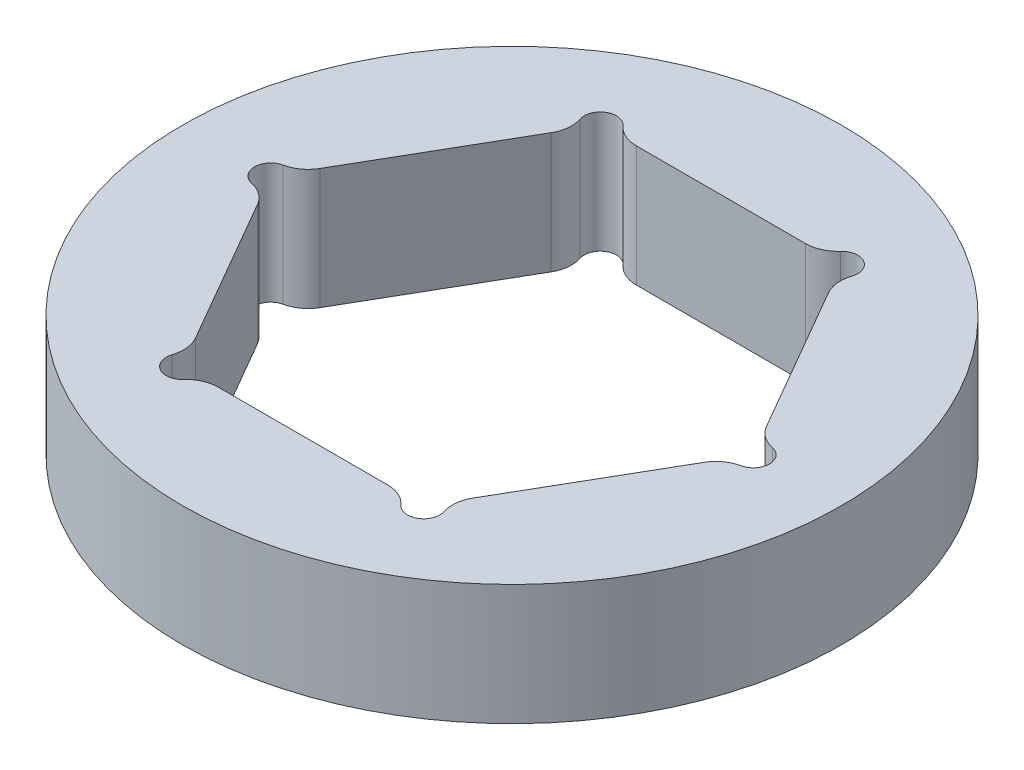
ISO-10303-21;
HEADER;
FILE_DESCRIPTION(('STEP AP214'),'2;1');
FILE_NAME('part.step','',(''),(''),'','','');
FILE_SCHEMA(('AUTOMOTIVE_DESIGN { 1 0 10303 214 1 1 1 1 }'));
ENDSEC;
DATA;
#1=APPLICATION_CONTEXT('core data for automotive mechanical design processes');
#2=APPLICATION_PROTOCOL_DEFINITION('international standard','automotive_design',2000,#1);
#3=PRODUCT_CONTEXT('',#1,'mechanical');
#4=PRODUCT('Part','Part','',(#3));
#5=PRODUCT_RELATED_PRODUCT_CATEGORY('part','',(#4));
#6=PRODUCT_DEFINITION_FORMATION('','',#4);
#7=PRODUCT_DEFINITION_CONTEXT('part definition',#1,'design');
#8=PRODUCT_DEFINITION('design','',#6,#7);
#9=PRODUCT_DEFINITION_SHAPE('','',#8);
#10=(LENGTH_UNIT() NAMED_UNIT(*) SI_UNIT(.MILLI.,.METRE.));
#11=(NAMED_UNIT(*) PLANE_ANGLE_UNIT() SI_UNIT($,.RADIAN.));
#12=(NAMED_UNIT(*) SI_UNIT($,.STERADIAN.) SOLID_ANGLE_UNIT());
#13=UNCERTAINTY_MEASURE_WITH_UNIT(LENGTH_MEASURE(1.E-05),#10,'distance_accuracy_value','');
#14=(GEOMETRIC_REPRESENTATION_CONTEXT(3) GLOBAL_UNCERTAINTY_ASSIGNED_CONTEXT((#13)) GLOBAL_UNIT_ASSIGNED_CONTEXT((#10,
#11,#12)) REPRESENTATION_CONTEXT('',''));
#15=CARTESIAN_POINT('',(0.,0.,0.));
#16=DIRECTION('',(0.,0.,1.));
#17=DIRECTION('',(1.,0.,0.));
#18=AXIS2_PLACEMENT_3D('',#15,#16,#17);
#19=CARTESIAN_POINT('',(0.,0.75,0.));
#20=DIRECTION('',(0.,1.,0.));
#21=DIRECTION('',(0.,0.,1.));
#22=AXIS2_PLACEMENT_3D('',#19,#20,#21);
#23=PLANE('',#22);
#24=CARTESIAN_POINT('',(0.,0.75,0.));
#25=DIRECTION('',(0.,1.,0.));
#26=DIRECTION('',(0.,0.,1.));
#27=AXIS2_PLACEMENT_3D('',#24,#25,#26);
#28=CIRCLE('',#27,4.1);
#29=CARTESIAN_POINT('',(0.,0.75,4.1));
#30=VERTEX_POINT('',#29);
#31=EDGE_CURVE('E11',#30,#30,#28,.T.);
#32=ORIENTED_EDGE('',*,*,#31,.T.);
#33=EDGE_LOOP('',(#32));
#34=FACE_BOUND('',#33,.T.);
#35=CARTESIAN_POINT('',(-1.50111069989303,0.75,-2.6));
#36=DIRECTION('',(0.,1.,0.));
#37=DIRECTION('',(0.,0.,1.));
#38=AXIS2_PLACEMENT_3D('',#35,#36,#37);
#39=CIRCLE('',#38,0.2);
#40=CARTESIAN_POINT('',(-1.35203950139304,0.75,-2.73333333333333));
#41=VERTEX_POINT('',#40);
#42=CARTESIAN_POINT('',(-1.69111635298094,0.75,-2.53756722179308));
#43=VERTEX_POINT('',#42);
#44=EDGE_CURVE('E206',#41,#43,#39,.T.);
#45=ORIENTED_EDGE('',*,*,#44,.F.);
#46=CARTESIAN_POINT('',(-1.05389710439307,0.75,-3.));
#47=DIRECTION('',(0.,-1.,0.));
#48=DIRECTION('',(0.,0.,1.));
#49=AXIS2_PLACEMENT_3D('',#46,#47,#48);
#50=CIRCLE('',#49,0.4);
#51=CARTESIAN_POINT('',(-1.05389710439307,0.75,-2.6));
#52=VERTEX_POINT('',#51);
#53=EDGE_CURVE('E198',#52,#41,#50,.T.);
#54=ORIENTED_EDGE('',*,*,#53,.F.);
#55=DIRECTION('',(-1.,0.,0.));
#56=VECTOR('',#55,1.);
#57=CARTESIAN_POINT('',(1.05389710439307,0.75,-2.6));
#58=LINE('',#57,#56);
#59=CARTESIAN_POINT('',(1.05389710439307,0.75,-2.6));
#60=VERTEX_POINT('',#59);
#61=EDGE_CURVE('E262',#60,#52,#58,.T.);
#62=ORIENTED_EDGE('',*,*,#61,.F.);
#63=CARTESIAN_POINT('',(1.05389710439307,0.75,-3.));
#64=DIRECTION('',(0.,-1.,0.));
#65=DIRECTION('',(0.,0.,1.));
#66=AXIS2_PLACEMENT_3D('',#63,#64,#65);
#67=CIRCLE('',#66,0.400000000000001);
#68=CARTESIAN_POINT('',(1.35203950139304,0.75,-2.73333333333333));
#69=VERTEX_POINT('',#68);
#70=EDGE_CURVE('E260',#69,#60,#67,.T.);
#71=ORIENTED_EDGE('',*,*,#70,.F.);
#72=CARTESIAN_POINT('',(1.50111069989303,0.75,-2.6));
#73=DIRECTION('',(0.,1.,0.));
#74=DIRECTION('',(0.,0.,1.));
#75=AXIS2_PLACEMENT_3D('',#72,#73,#74);
#76=CIRCLE('',#75,0.2);
#77=CARTESIAN_POINT('',(1.69111635298095,0.75,-2.53756722179308));
#78=VERTEX_POINT('',#77);
#79=EDGE_CURVE('E258',#78,#69,#76,.T.);
#80=ORIENTED_EDGE('',*,*,#79,.F.);
#81=CARTESIAN_POINT('',(2.07112765915678,0.75,-2.41270166537926));
#82=DIRECTION('',(0.,-1.,0.));
#83=DIRECTION('',(0.,0.,1.));
#84=AXIS2_PLACEMENT_3D('',#81,#82,#83);
#85=CIRCLE('',#84,0.399999999999999);
#86=CARTESIAN_POINT('',(1.72471749764301,0.75,-2.21270166537926));
#87=VERTEX_POINT('',#86);
#88=EDGE_CURVE('E256',#87,#78,#85,.T.);
#89=ORIENTED_EDGE('',*,*,#88,.F.);
#90=DIRECTION('',(-0.5,0.,-0.866025403784439));
#91=VECTOR('',#90,1.);
#92=CARTESIAN_POINT('',(2.77861460203608,0.75,-0.387298334620741));
#93=LINE('',#92,#91);
#94=CARTESIAN_POINT('',(2.77861460203608,0.75,-0.387298334620741));
#95=VERTEX_POINT('',#94);
#96=EDGE_CURVE('E254',#95,#87,#93,.T.);
#97=ORIENTED_EDGE('',*,*,#96,.F.);
#98=CARTESIAN_POINT('',(3.12502476354985,0.75,-0.58729833462074));
#99=DIRECTION('',(0.,-1.,0.));
#100=DIRECTION('',(0.,0.,1.));
#101=AXIS2_PLACEMENT_3D('',#98,#99,#100);
#102=CIRCLE('',#101,0.4);
#103=CARTESIAN_POINT('',(3.04315585437399,0.75,-0.195766111540246));
#104=VERTEX_POINT('',#103);
#105=EDGE_CURVE('E252',#104,#95,#102,.T.);
#106=ORIENTED_EDGE('',*,*,#105,.F.);
#107=CARTESIAN_POINT('',(3.00222139978606,0.75,0.));
#108=DIRECTION('',(0.,1.,0.));
#109=DIRECTION('',(0.,0.,1.));
#110=AXIS2_PLACEMENT_3D('',#107,#108,#109);
#111=CIRCLE('',#110,0.2);
#112=CARTESIAN_POINT('',(3.04315585437399,0.75,0.195766111540249));
#113=VERTEX_POINT('',#112);
#114=EDGE_CURVE('E250',#113,#104,#111,.T.);
#115=ORIENTED_EDGE('',*,*,#114,.F.);
#116=CARTESIAN_POINT('',(3.12502476354985,0.75,0.587298334620743));
#117=DIRECTION('',(0.,-1.,0.));
#118=DIRECTION('',(0.,0.,1.));
#119=AXIS2_PLACEMENT_3D('',#116,#117,#118);
#120=CIRCLE('',#119,0.4);
#121=CARTESIAN_POINT('',(2.77861460203608,0.75,0.387298334620744));
#122=VERTEX_POINT('',#121);
#123=EDGE_CURVE('E248',#122,#113,#120,.T.);
#124=ORIENTED_EDGE('',*,*,#123,.F.);
#125=DIRECTION('',(0.5,0.,-0.866025403784438));
#126=VECTOR('',#125,1.);
#127=CARTESIAN_POINT('',(1.72471749764301,0.75,2.21270166537926));
#128=LINE('',#127,#126);
#129=CARTESIAN_POINT('',(1.72471749764301,0.75,2.21270166537926));
#130=VERTEX_POINT('',#129);
#131=EDGE_CURVE('E246',#130,#122,#128,.T.);
#132=ORIENTED_EDGE('',*,*,#131,.F.);
#133=CARTESIAN_POINT('',(2.07112765915678,0.75,2.41270166537926));
#134=DIRECTION('',(0.,-1.,0.));
#135=DIRECTION('',(0.,0.,1.));
#136=AXIS2_PLACEMENT_3D('',#133,#134,#135);
#137=CIRCLE('',#136,0.4);
#138=CARTESIAN_POINT('',(1.69111635298095,0.75,2.53756722179309));
#139=VERTEX_POINT('',#138);
#140=EDGE_CURVE('E244',#139,#130,#137,.T.);
#141=ORIENTED_EDGE('',*,*,#140,.F.);
#142=CARTESIAN_POINT('',(1.50111069989303,0.75,2.6));
#143=DIRECTION('',(0.,1.,0.));
#144=DIRECTION('',(0.,0.,1.));
#145=AXIS2_PLACEMENT_3D('',#142,#143,#144);
#146=CIRCLE('',#145,0.2);
#147=CARTESIAN_POINT('',(1.35203950139304,0.75,2.73333333333334));
#148=VERTEX_POINT('',#147);
#149=EDGE_CURVE('E242',#148,#139,#146,.T.);
#150=ORIENTED_EDGE('',*,*,#149,.F.);
#151=CARTESIAN_POINT('',(1.05389710439307,0.75,3.));
#152=DIRECTION('',(0.,-1.,0.));
#153=DIRECTION('',(0.,0.,1.));
#154=AXIS2_PLACEMENT_3D('',#151,#152,#153);
#155=CIRCLE('',#154,0.4);
#156=CARTESIAN_POINT('',(1.05389710439307,0.75,2.6));
#157=VERTEX_POINT('',#156);
#158=EDGE_CURVE('E240',#157,#148,#155,.T.);
#159=ORIENTED_EDGE('',*,*,#158,.F.);
#160=DIRECTION('',(1.,0.,0.));
#161=VECTOR('',#160,1.);
#162=CARTESIAN_POINT('',(-1.05389710439306,0.75,2.6));
#163=LINE('',#162,#161);
#164=CARTESIAN_POINT('',(-1.05389710439306,0.75,2.6));
#165=VERTEX_POINT('',#164);
#166=EDGE_CURVE('E238',#165,#157,#163,.T.);
#167=ORIENTED_EDGE('',*,*,#166,.F.);
#168=CARTESIAN_POINT('',(-1.05389710439306,0.75,3.));
#169=DIRECTION('',(0.,-1.,0.));
#170=DIRECTION('',(0.,0.,1.));
#171=AXIS2_PLACEMENT_3D('',#168,#169,#170);
#172=CIRCLE('',#171,0.4);
#173=CARTESIAN_POINT('',(-1.35203950139304,0.75,2.73333333333333));
#174=VERTEX_POINT('',#173);
#175=EDGE_CURVE('E236',#174,#165,#172,.T.);
#176=ORIENTED_EDGE('',*,*,#175,.F.);
#177=CARTESIAN_POINT('',(-1.50111069989303,0.75,2.6));
#178=DIRECTION('',(0.,1.,0.));
#179=DIRECTION('',(0.,0.,1.));
#180=AXIS2_PLACEMENT_3D('',#177,#178,#179);
#181=CIRCLE('',#180,0.2);
#182=CARTESIAN_POINT('',(-1.69111635298094,0.75,2.53756722179309));
#183=VERTEX_POINT('',#182);
#184=EDGE_CURVE('E234',#183,#174,#181,.T.);
#185=ORIENTED_EDGE('',*,*,#184,.F.);
#186=CARTESIAN_POINT('',(-2.07112765915678,0.75,2.41270166537926));
#187=DIRECTION('',(0.,-1.,0.));
#188=DIRECTION('',(0.,0.,1.));
#189=AXIS2_PLACEMENT_3D('',#186,#187,#188);
#190=CIRCLE('',#189,0.4);
#191=CARTESIAN_POINT('',(-1.724717497643,0.75,2.21270166537926));
#192=VERTEX_POINT('',#191);
#193=EDGE_CURVE('E232',#192,#183,#190,.T.);
#194=ORIENTED_EDGE('',*,*,#193,.F.);
#195=DIRECTION('',(0.5,0.,0.866025403784439));
#196=VECTOR('',#195,1.);
#197=CARTESIAN_POINT('',(-2.77861460203607,0.75,0.387298334620747));
#198=LINE('',#197,#196);
#199=CARTESIAN_POINT('',(-2.77861460203607,0.75,0.387298334620746));
#200=VERTEX_POINT('',#199);
#201=EDGE_CURVE('E230',#200,#192,#198,.T.);
#202=ORIENTED_EDGE('',*,*,#201,.F.);
#203=CARTESIAN_POINT('',(-3.12502476354985,0.75,0.587298334620746));
#204=DIRECTION('',(0.,-1.,0.));
#205=DIRECTION('',(0.,0.,1.));
#206=AXIS2_PLACEMENT_3D('',#203,#204,#205);
#207=CIRCLE('',#206,0.4);
#208=CARTESIAN_POINT('',(-3.04315585437398,0.75,0.195766111540248));
#209=VERTEX_POINT('',#208);
#210=EDGE_CURVE('E228',#209,#200,#207,.T.);
#211=ORIENTED_EDGE('',*,*,#210,.F.);
#212=CARTESIAN_POINT('',(-3.00222139978605,0.75,0.));
#213=DIRECTION('',(0.,1.,0.));
#214=DIRECTION('',(0.,0.,1.));
#215=AXIS2_PLACEMENT_3D('',#212,#213,#214);
#216=CIRCLE('',#215,0.2);
#217=CARTESIAN_POINT('',(-3.04315585437398,0.75,-0.195766111540243));
#218=VERTEX_POINT('',#217);
#219=EDGE_CURVE('E226',#218,#209,#216,.T.);
#220=ORIENTED_EDGE('',*,*,#219,.F.);
#221=CARTESIAN_POINT('',(-3.12502476354985,0.75,-0.587298334620737));
#222=DIRECTION('',(0.,-1.,0.));
#223=DIRECTION('',(0.,0.,1.));
#224=AXIS2_PLACEMENT_3D('',#221,#222,#223);
#225=CIRCLE('',#224,0.4);
#226=CARTESIAN_POINT('',(-2.77861460203607,0.75,-0.387298334620738));
#227=VERTEX_POINT('',#226);
#228=EDGE_CURVE('E224',#227,#218,#225,.T.);
#229=ORIENTED_EDGE('',*,*,#228,.F.);
#230=DIRECTION('',(-0.5,0.,0.866025403784438));
#231=VECTOR('',#230,1.);
#232=CARTESIAN_POINT('',(-1.724717497643,0.75,-2.21270166537925));
#233=LINE('',#232,#231);
#234=CARTESIAN_POINT('',(-1.724717497643,0.75,-2.21270166537925));
#235=VERTEX_POINT('',#234);
#236=EDGE_CURVE('E220',#235,#227,#233,.T.);
#237=ORIENTED_EDGE('',*,*,#236,.F.);
#238=CARTESIAN_POINT('',(-2.07112765915678,0.75,-2.41270166537926));
#239=DIRECTION('',(0.,-1.,0.));
#240=DIRECTION('',(0.,0.,1.));
#241=AXIS2_PLACEMENT_3D('',#238,#239,#240);
#242=CIRCLE('',#241,0.4);
#243=EDGE_CURVE('E218',#43,#235,#242,.T.);
#244=ORIENTED_EDGE('',*,*,#243,.F.);
#245=EDGE_LOOP('',(#45,#54,#62,#71,#80,#89,#97,#106,#115,#124,#132,#141,#150,#159,#167,#176,
#185,#194,#202,#211,#220,#229,#237,#244));
#246=FACE_BOUND('',#245,.T.);
#247=ADVANCED_FACE('F37',(#34,#246),#23,.T.);
#248=CARTESIAN_POINT('',(0.,-0.75,0.));
#249=DIRECTION('',(0.,1.,0.));
#250=DIRECTION('',(0.,0.,1.));
#251=AXIS2_PLACEMENT_3D('',#248,#249,#250);
#252=PLANE('',#251);
#253=CARTESIAN_POINT('',(0.,-0.75,0.));
#254=DIRECTION('',(0.,1.,0.));
#255=DIRECTION('',(0.,0.,1.));
#256=AXIS2_PLACEMENT_3D('',#253,#254,#255);
#257=CIRCLE('',#256,4.1);
#258=CARTESIAN_POINT('',(0.,-0.75,4.1));
#259=VERTEX_POINT('',#258);
#260=EDGE_CURVE('E41',#259,#259,#257,.T.);
#261=ORIENTED_EDGE('',*,*,#260,.F.);
#262=EDGE_LOOP('',(#261));
#263=FACE_BOUND('',#262,.T.);
#264=CARTESIAN_POINT('',(-1.05389710439307,-0.75,-3.));
#265=DIRECTION('',(0.,-1.,0.));
#266=DIRECTION('',(0.,0.,1.));
#267=AXIS2_PLACEMENT_3D('',#264,#265,#266);
#268=CIRCLE('',#267,0.4);
#269=CARTESIAN_POINT('',(-1.05389710439307,-0.75,-2.6));
#270=VERTEX_POINT('',#269);
#271=CARTESIAN_POINT('',(-1.35203950139304,-0.75,-2.73333333333333));
#272=VERTEX_POINT('',#271);
#273=EDGE_CURVE('E60',#270,#272,#268,.T.);
#274=ORIENTED_EDGE('',*,*,#273,.T.);
#275=CARTESIAN_POINT('',(-1.50111069989303,-0.75,-2.6));
#276=DIRECTION('',(0.,1.,0.));
#277=DIRECTION('',(0.,0.,1.));
#278=AXIS2_PLACEMENT_3D('',#275,#276,#277);
#279=CIRCLE('',#278,0.2);
#280=CARTESIAN_POINT('',(-1.69111635298094,-0.75,-2.53756722179308));
#281=VERTEX_POINT('',#280);
#282=EDGE_CURVE('E213',#272,#281,#279,.T.);
#283=ORIENTED_EDGE('',*,*,#282,.T.);
#284=CARTESIAN_POINT('',(-2.07112765915678,-0.75,-2.41270166537926));
#285=DIRECTION('',(0.,-1.,0.));
#286=DIRECTION('',(0.,0.,1.));
#287=AXIS2_PLACEMENT_3D('',#284,#285,#286);
#288=CIRCLE('',#287,0.4);
#289=CARTESIAN_POINT('',(-1.724717497643,-0.75,-2.21270166537925));
#290=VERTEX_POINT('',#289);
#291=EDGE_CURVE('E266',#281,#290,#288,.T.);
#292=ORIENTED_EDGE('',*,*,#291,.T.);
#293=DIRECTION('',(-0.5,0.,0.866025403784438));
#294=VECTOR('',#293,1.);
#295=CARTESIAN_POINT('',(-1.724717497643,-0.75,-2.21270166537925));
#296=LINE('',#295,#294);
#297=CARTESIAN_POINT('',(-2.77861460203607,-0.75,-0.387298334620738));
#298=VERTEX_POINT('',#297);
#299=EDGE_CURVE('E269',#290,#298,#296,.T.);
#300=ORIENTED_EDGE('',*,*,#299,.T.);
#301=CARTESIAN_POINT('',(-3.12502476354985,-0.75,-0.587298334620737));
#302=DIRECTION('',(0.,-1.,0.));
#303=DIRECTION('',(0.,0.,1.));
#304=AXIS2_PLACEMENT_3D('',#301,#302,#303);
#305=CIRCLE('',#304,0.4);
#306=CARTESIAN_POINT('',(-3.04315585437398,-0.75,-0.195766111540243));
#307=VERTEX_POINT('',#306);
#308=EDGE_CURVE('E272',#298,#307,#305,.T.);
#309=ORIENTED_EDGE('',*,*,#308,.T.);
#310=CARTESIAN_POINT('',(-3.00222139978605,-0.75,0.));
#311=DIRECTION('',(0.,1.,0.));
#312=DIRECTION('',(0.,0.,1.));
#313=AXIS2_PLACEMENT_3D('',#310,#311,#312);
#314=CIRCLE('',#313,0.2);
#315=CARTESIAN_POINT('',(-3.04315585437398,-0.75,0.195766111540248));
#316=VERTEX_POINT('',#315);
#317=EDGE_CURVE('E275',#307,#316,#314,.T.);
#318=ORIENTED_EDGE('',*,*,#317,.T.);
#319=CARTESIAN_POINT('',(-3.12502476354985,-0.75,0.587298334620746));
#320=DIRECTION('',(0.,-1.,0.));
#321=DIRECTION('',(0.,0.,1.));
#322=AXIS2_PLACEMENT_3D('',#319,#320,#321);
#323=CIRCLE('',#322,0.4);
#324=CARTESIAN_POINT('',(-2.77861460203607,-0.75,0.387298334620746));
#325=VERTEX_POINT('',#324);
#326=EDGE_CURVE('E278',#316,#325,#323,.T.);
#327=ORIENTED_EDGE('',*,*,#326,.T.);
#328=DIRECTION('',(0.5,0.,0.866025403784439));
#329=VECTOR('',#328,1.);
#330=CARTESIAN_POINT('',(-2.77861460203607,-0.75,0.387298334620747));
#331=LINE('',#330,#329);
#332=CARTESIAN_POINT('',(-1.724717497643,-0.75,2.21270166537926));
#333=VERTEX_POINT('',#332);
#334=EDGE_CURVE('E281',#325,#333,#331,.T.);
#335=ORIENTED_EDGE('',*,*,#334,.T.);
#336=CARTESIAN_POINT('',(-2.07112765915678,-0.75,2.41270166537926));
#337=DIRECTION('',(0.,-1.,0.));
#338=DIRECTION('',(0.,0.,1.));
#339=AXIS2_PLACEMENT_3D('',#336,#337,#338);
#340=CIRCLE('',#339,0.4);
#341=CARTESIAN_POINT('',(-1.69111635298094,-0.75,2.53756722179309));
#342=VERTEX_POINT('',#341);
#343=EDGE_CURVE('E284',#333,#342,#340,.T.);
#344=ORIENTED_EDGE('',*,*,#343,.T.);
#345=CARTESIAN_POINT('',(-1.50111069989303,-0.75,2.6));
#346=DIRECTION('',(0.,1.,0.));
#347=DIRECTION('',(0.,0.,1.));
#348=AXIS2_PLACEMENT_3D('',#345,#346,#347);
#349=CIRCLE('',#348,0.2);
#350=CARTESIAN_POINT('',(-1.35203950139304,-0.75,2.73333333333333));
#351=VERTEX_POINT('',#350);
#352=EDGE_CURVE('E287',#342,#351,#349,.T.);
#353=ORIENTED_EDGE('',*,*,#352,.T.);
#354=CARTESIAN_POINT('',(-1.05389710439306,-0.75,3.));
#355=DIRECTION('',(0.,-1.,0.));
#356=DIRECTION('',(0.,0.,1.));
#357=AXIS2_PLACEMENT_3D('',#354,#355,#356);
#358=CIRCLE('',#357,0.4);
#359=CARTESIAN_POINT('',(-1.05389710439306,-0.75,2.6));
#360=VERTEX_POINT('',#359);
#361=EDGE_CURVE('E290',#351,#360,#358,.T.);
#362=ORIENTED_EDGE('',*,*,#361,.T.);
#363=DIRECTION('',(1.,0.,0.));
#364=VECTOR('',#363,1.);
#365=CARTESIAN_POINT('',(-1.05389710439306,-0.75,2.6));
#366=LINE('',#365,#364);
#367=CARTESIAN_POINT('',(1.05389710439307,-0.75,2.6));
#368=VERTEX_POINT('',#367);
#369=EDGE_CURVE('E293',#360,#368,#366,.T.);
#370=ORIENTED_EDGE('',*,*,#369,.T.);
#371=CARTESIAN_POINT('',(1.05389710439307,-0.75,3.));
#372=DIRECTION('',(0.,-1.,0.));
#373=DIRECTION('',(0.,0.,1.));
#374=AXIS2_PLACEMENT_3D('',#371,#372,#373);
#375=CIRCLE('',#374,0.4);
#376=CARTESIAN_POINT('',(1.35203950139304,-0.75,2.73333333333334));
#377=VERTEX_POINT('',#376);
#378=EDGE_CURVE('E296',#368,#377,#375,.T.);
#379=ORIENTED_EDGE('',*,*,#378,.T.);
#380=CARTESIAN_POINT('',(1.50111069989303,-0.75,2.6));
#381=DIRECTION('',(0.,1.,0.));
#382=DIRECTION('',(0.,0.,1.));
#383=AXIS2_PLACEMENT_3D('',#380,#381,#382);
#384=CIRCLE('',#383,0.2);
#385=CARTESIAN_POINT('',(1.69111635298095,-0.75,2.53756722179309));
#386=VERTEX_POINT('',#385);
#387=EDGE_CURVE('E299',#377,#386,#384,.T.);
#388=ORIENTED_EDGE('',*,*,#387,.T.);
#389=CARTESIAN_POINT('',(2.07112765915678,-0.75,2.41270166537926));
#390=DIRECTION('',(0.,-1.,0.));
#391=DIRECTION('',(0.,0.,1.));
#392=AXIS2_PLACEMENT_3D('',#389,#390,#391);
#393=CIRCLE('',#392,0.4);
#394=CARTESIAN_POINT('',(1.72471749764301,-0.75,2.21270166537926));
#395=VERTEX_POINT('',#394);
#396=EDGE_CURVE('E302',#386,#395,#393,.T.);
#397=ORIENTED_EDGE('',*,*,#396,.T.);
#398=DIRECTION('',(0.5,0.,-0.866025403784438));
#399=VECTOR('',#398,1.);
#400=CARTESIAN_POINT('',(1.72471749764301,-0.75,2.21270166537926));
#401=LINE('',#400,#399);
#402=CARTESIAN_POINT('',(2.77861460203608,-0.75,0.387298334620744));
#403=VERTEX_POINT('',#402);
#404=EDGE_CURVE('E305',#395,#403,#401,.T.);
#405=ORIENTED_EDGE('',*,*,#404,.T.);
#406=CARTESIAN_POINT('',(3.12502476354985,-0.75,0.587298334620743));
#407=DIRECTION('',(0.,-1.,0.));
#408=DIRECTION('',(0.,0.,1.));
#409=AXIS2_PLACEMENT_3D('',#406,#407,#408);
#410=CIRCLE('',#409,0.4);
#411=CARTESIAN_POINT('',(3.04315585437399,-0.75,0.195766111540249));
#412=VERTEX_POINT('',#411);
#413=EDGE_CURVE('E308',#403,#412,#410,.T.);
#414=ORIENTED_EDGE('',*,*,#413,.T.);
#415=CARTESIAN_POINT('',(3.00222139978606,-0.75,0.));
#416=DIRECTION('',(0.,1.,0.));
#417=DIRECTION('',(0.,0.,1.));
#418=AXIS2_PLACEMENT_3D('',#415,#416,#417);
#419=CIRCLE('',#418,0.2);
#420=CARTESIAN_POINT('',(3.04315585437399,-0.75,-0.195766111540246));
#421=VERTEX_POINT('',#420);
#422=EDGE_CURVE('E311',#412,#421,#419,.T.);
#423=ORIENTED_EDGE('',*,*,#422,.T.);
#424=CARTESIAN_POINT('',(3.12502476354985,-0.75,-0.58729833462074));
#425=DIRECTION('',(0.,-1.,0.));
#426=DIRECTION('',(0.,0.,1.));
#427=AXIS2_PLACEMENT_3D('',#424,#425,#426);
#428=CIRCLE('',#427,0.4);
#429=CARTESIAN_POINT('',(2.77861460203608,-0.75,-0.387298334620741));
#430=VERTEX_POINT('',#429);
#431=EDGE_CURVE('E314',#421,#430,#428,.T.);
#432=ORIENTED_EDGE('',*,*,#431,.T.);
#433=DIRECTION('',(-0.5,0.,-0.866025403784439));
#434=VECTOR('',#433,1.);
#435=CARTESIAN_POINT('',(2.77861460203608,-0.75,-0.387298334620741));
#436=LINE('',#435,#434);
#437=CARTESIAN_POINT('',(1.72471749764301,-0.75,-2.21270166537926));
#438=VERTEX_POINT('',#437);
#439=EDGE_CURVE('E317',#430,#438,#436,.T.);
#440=ORIENTED_EDGE('',*,*,#439,.T.);
#441=CARTESIAN_POINT('',(2.07112765915678,-0.75,-2.41270166537926));
#442=DIRECTION('',(0.,-1.,0.));
#443=DIRECTION('',(0.,0.,1.));
#444=AXIS2_PLACEMENT_3D('',#441,#442,#443);
#445=CIRCLE('',#444,0.399999999999999);
#446=CARTESIAN_POINT('',(1.69111635298095,-0.75,-2.53756722179308));
#447=VERTEX_POINT('',#446);
#448=EDGE_CURVE('E320',#438,#447,#445,.T.);
#449=ORIENTED_EDGE('',*,*,#448,.T.);
#450=CARTESIAN_POINT('',(1.50111069989303,-0.75,-2.6));
#451=DIRECTION('',(0.,1.,0.));
#452=DIRECTION('',(0.,0.,1.));
#453=AXIS2_PLACEMENT_3D('',#450,#451,#452);
#454=CIRCLE('',#453,0.2);
#455=CARTESIAN_POINT('',(1.35203950139304,-0.75,-2.73333333333333));
#456=VERTEX_POINT('',#455);
#457=EDGE_CURVE('E323',#447,#456,#454,.T.);
#458=ORIENTED_EDGE('',*,*,#457,.T.);
#459=CARTESIAN_POINT('',(1.05389710439307,-0.75,-3.));
#460=DIRECTION('',(0.,-1.,0.));
#461=DIRECTION('',(0.,0.,1.));
#462=AXIS2_PLACEMENT_3D('',#459,#460,#461);
#463=CIRCLE('',#462,0.400000000000001);
#464=CARTESIAN_POINT('',(1.05389710439307,-0.75,-2.6));
#465=VERTEX_POINT('',#464);
#466=EDGE_CURVE('E326',#456,#465,#463,.T.);
#467=ORIENTED_EDGE('',*,*,#466,.T.);
#468=DIRECTION('',(-1.,0.,0.));
#469=VECTOR('',#468,1.);
#470=CARTESIAN_POINT('',(1.05389710439307,-0.75,-2.6));
#471=LINE('',#470,#469);
#472=EDGE_CURVE('E207',#465,#270,#471,.T.);
#473=ORIENTED_EDGE('',*,*,#472,.T.);
#474=EDGE_LOOP('',(#274,#283,#292,#300,#309,#318,#327,#335,#344,#353,#362,#370,#379,#388,#397,
#405,#414,#423,#432,#440,#449,#458,#467,#473));
#475=FACE_BOUND('',#474,.T.);
#476=ADVANCED_FACE('F379',(#263,#475),#252,.F.);
#477=CARTESIAN_POINT('',(0.,0.75,0.));
#478=DIRECTION('',(0.,-1.,0.));
#479=DIRECTION('',(0.,0.,-1.));
#480=AXIS2_PLACEMENT_3D('',#477,#478,#479);
#481=CYLINDRICAL_SURFACE('',#480,4.1);
#482=ORIENTED_EDGE('',*,*,#31,.F.);
#483=EDGE_LOOP('',(#482));
#484=FACE_BOUND('',#483,.T.);
#485=ORIENTED_EDGE('',*,*,#260,.T.);
#486=EDGE_LOOP('',(#485));
#487=FACE_BOUND('',#486,.T.);
#488=ADVANCED_FACE('F39',(#484,#487),#481,.T.);
#489=CARTESIAN_POINT('',(-1.05389710439307,0.75,-3.));
#490=DIRECTION('',(0.,-1.,0.));
#491=DIRECTION('',(0.,0.,-1.));
#492=AXIS2_PLACEMENT_3D('',#489,#490,#491);
#493=CYLINDRICAL_SURFACE('',#492,0.4);
#494=ORIENTED_EDGE('',*,*,#273,.F.);
#495=DIRECTION('',(0.,-1.,0.));
#496=VECTOR('',#495,1.);
#497=CARTESIAN_POINT('',(-1.05389710439307,0.75,-2.6));
#498=LINE('',#497,#496);
#499=EDGE_CURVE('E202',#52,#270,#498,.T.);
#500=ORIENTED_EDGE('',*,*,#499,.F.);
#501=ORIENTED_EDGE('',*,*,#53,.T.);
#502=DIRECTION('',(0.,-1.,0.));
#503=VECTOR('',#502,1.);
#504=CARTESIAN_POINT('',(-1.35203950139304,0.75,-2.73333333333333));
#505=LINE('',#504,#503);
#506=EDGE_CURVE('E201',#41,#272,#505,.T.);
#507=ORIENTED_EDGE('',*,*,#506,.T.);
#508=EDGE_LOOP('',(#494,#500,#501,#507));
#509=FACE_BOUND('',#508,.T.);
#510=ADVANCED_FACE('F200',(#509),#493,.T.);
#511=CARTESIAN_POINT('',(-1.50111069989303,0.75,-2.6));
#512=DIRECTION('',(0.,-1.,0.));
#513=DIRECTION('',(0.,0.,-1.));
#514=AXIS2_PLACEMENT_3D('',#511,#512,#513);
#515=CYLINDRICAL_SURFACE('',#514,0.2);
#516=ORIENTED_EDGE('',*,*,#282,.F.);
#517=ORIENTED_EDGE('',*,*,#506,.F.);
#518=ORIENTED_EDGE('',*,*,#44,.T.);
#519=DIRECTION('',(0.,-1.,0.));
#520=VECTOR('',#519,1.);
#521=CARTESIAN_POINT('',(-1.69111635298094,0.75,-2.53756722179308));
#522=LINE('',#521,#520);
#523=EDGE_CURVE('E214',#43,#281,#522,.T.);
#524=ORIENTED_EDGE('',*,*,#523,.T.);
#525=EDGE_LOOP('',(#516,#517,#518,#524));
#526=FACE_BOUND('',#525,.T.);
#527=ADVANCED_FACE('F210',(#526),#515,.F.);
#528=CARTESIAN_POINT('',(-2.07112765915678,0.75,-2.41270166537926));
#529=DIRECTION('',(0.,-1.,0.));
#530=DIRECTION('',(0.,0.,-1.));
#531=AXIS2_PLACEMENT_3D('',#528,#529,#530);
#532=CYLINDRICAL_SURFACE('',#531,0.4);
#533=ORIENTED_EDGE('',*,*,#291,.F.);
#534=ORIENTED_EDGE('',*,*,#523,.F.);
#535=ORIENTED_EDGE('',*,*,#243,.T.);
#536=DIRECTION('',(0.,-1.,0.));
#537=VECTOR('',#536,1.);
#538=CARTESIAN_POINT('',(-1.724717497643,0.75,-2.21270166537925));
#539=LINE('',#538,#537);
#540=EDGE_CURVE('E371',#235,#290,#539,.T.);
#541=ORIENTED_EDGE('',*,*,#540,.T.);
#542=EDGE_LOOP('',(#533,#534,#535,#541));
#543=FACE_BOUND('',#542,.T.);
#544=ADVANCED_FACE('F375',(#543),#532,.T.);
#545=CARTESIAN_POINT('',(-1.724717497643,0.75,-2.21270166537925));
#546=DIRECTION('',(0.866025403784439,0.,0.5));
#547=DIRECTION('',(0.5,0.,-0.866025403784439));
#548=AXIS2_PLACEMENT_3D('',#545,#546,#547);
#549=PLANE('',#548);
#550=ORIENTED_EDGE('',*,*,#299,.F.);
#551=ORIENTED_EDGE('',*,*,#540,.F.);
#552=ORIENTED_EDGE('',*,*,#236,.T.);
#553=DIRECTION('',(0.,-1.,0.));
#554=VECTOR('',#553,1.);
#555=CARTESIAN_POINT('',(-2.77861460203607,0.75,-0.387298334620738));
#556=LINE('',#555,#554);
#557=EDGE_CURVE('E369',#227,#298,#556,.T.);
#558=ORIENTED_EDGE('',*,*,#557,.T.);
#559=EDGE_LOOP('',(#550,#551,#552,#558));
#560=FACE_BOUND('',#559,.T.);
#561=ADVANCED_FACE('F477',(#560),#549,.T.);
#562=CARTESIAN_POINT('',(-3.12502476354985,0.75,-0.587298334620737));
#563=DIRECTION('',(0.,-1.,0.));
#564=DIRECTION('',(0.,0.,-1.));
#565=AXIS2_PLACEMENT_3D('',#562,#563,#564);
#566=CYLINDRICAL_SURFACE('',#565,0.4);
#567=ORIENTED_EDGE('',*,*,#308,.F.);
#568=ORIENTED_EDGE('',*,*,#557,.F.);
#569=ORIENTED_EDGE('',*,*,#228,.T.);
#570=DIRECTION('',(0.,-1.,0.));
#571=VECTOR('',#570,1.);
#572=CARTESIAN_POINT('',(-3.04315585437398,0.75,-0.195766111540243));
#573=LINE('',#572,#571);
#574=EDGE_CURVE('E367',#218,#307,#573,.T.);
#575=ORIENTED_EDGE('',*,*,#574,.T.);
#576=EDGE_LOOP('',(#567,#568,#569,#575));
#577=FACE_BOUND('',#576,.T.);
#578=ADVANCED_FACE('F475',(#577),#566,.T.);
#579=CARTESIAN_POINT('',(-3.00222139978605,0.75,0.));
#580=DIRECTION('',(0.,-1.,0.));
#581=DIRECTION('',(0.,0.,-1.));
#582=AXIS2_PLACEMENT_3D('',#579,#580,#581);
#583=CYLINDRICAL_SURFACE('',#582,0.2);
#584=ORIENTED_EDGE('',*,*,#317,.F.);
#585=ORIENTED_EDGE('',*,*,#574,.F.);
#586=ORIENTED_EDGE('',*,*,#219,.T.);
#587=DIRECTION('',(0.,-1.,0.));
#588=VECTOR('',#587,1.);
#589=CARTESIAN_POINT('',(-3.04315585437398,0.75,0.195766111540248));
#590=LINE('',#589,#588);
#591=EDGE_CURVE('E365',#209,#316,#590,.T.);
#592=ORIENTED_EDGE('',*,*,#591,.T.);
#593=EDGE_LOOP('',(#584,#585,#586,#592));
#594=FACE_BOUND('',#593,.T.);
#595=ADVANCED_FACE('F469',(#594),#583,.F.);
#596=CARTESIAN_POINT('',(-3.12502476354985,0.75,0.587298334620746));
#597=DIRECTION('',(0.,-1.,0.));
#598=DIRECTION('',(0.,0.,-1.));
#599=AXIS2_PLACEMENT_3D('',#596,#597,#598);
#600=CYLINDRICAL_SURFACE('',#599,0.4);
#601=ORIENTED_EDGE('',*,*,#326,.F.);
#602=ORIENTED_EDGE('',*,*,#591,.F.);
#603=ORIENTED_EDGE('',*,*,#210,.T.);
#604=DIRECTION('',(0.,-1.,0.));
#605=VECTOR('',#604,1.);
#606=CARTESIAN_POINT('',(-2.77861460203607,0.75,0.387298334620746));
#607=LINE('',#606,#605);
#608=EDGE_CURVE('E363',#200,#325,#607,.T.);
#609=ORIENTED_EDGE('',*,*,#608,.T.);
#610=EDGE_LOOP('',(#601,#602,#603,#609));
#611=FACE_BOUND('',#610,.T.);
#612=ADVANCED_FACE('F465',(#611),#600,.T.);
#613=CARTESIAN_POINT('',(-2.77861460203607,0.75,0.387298334620747));
#614=DIRECTION('',(0.866025403784438,0.,-0.5));
#615=DIRECTION('',(-0.5,0.,-0.866025403784439));
#616=AXIS2_PLACEMENT_3D('',#613,#614,#615);
#617=PLANE('',#616);
#618=ORIENTED_EDGE('',*,*,#334,.F.);
#619=ORIENTED_EDGE('',*,*,#608,.F.);
#620=ORIENTED_EDGE('',*,*,#201,.T.);
#621=DIRECTION('',(0.,-1.,0.));
#622=VECTOR('',#621,1.);
#623=CARTESIAN_POINT('',(-1.724717497643,0.75,2.21270166537926));
#624=LINE('',#623,#622);
#625=EDGE_CURVE('E361',#192,#333,#624,.T.);
#626=ORIENTED_EDGE('',*,*,#625,.T.);
#627=EDGE_LOOP('',(#618,#619,#620,#626));
#628=FACE_BOUND('',#627,.T.);
#629=ADVANCED_FACE('F462',(#628),#617,.T.);
#630=CARTESIAN_POINT('',(-2.07112765915678,0.75,2.41270166537926));
#631=DIRECTION('',(0.,-1.,0.));
#632=DIRECTION('',(0.,0.,-1.));
#633=AXIS2_PLACEMENT_3D('',#630,#631,#632);
#634=CYLINDRICAL_SURFACE('',#633,0.4);
#635=ORIENTED_EDGE('',*,*,#343,.F.);
#636=ORIENTED_EDGE('',*,*,#625,.F.);
#637=ORIENTED_EDGE('',*,*,#193,.T.);
#638=DIRECTION('',(0.,-1.,0.));
#639=VECTOR('',#638,1.);
#640=CARTESIAN_POINT('',(-1.69111635298094,0.75,2.53756722179309));
#641=LINE('',#640,#639);
#642=EDGE_CURVE('E359',#183,#342,#641,.T.);
#643=ORIENTED_EDGE('',*,*,#642,.T.);
#644=EDGE_LOOP('',(#635,#636,#637,#643));
#645=FACE_BOUND('',#644,.T.);
#646=ADVANCED_FACE('F454',(#645),#634,.T.);
#647=CARTESIAN_POINT('',(-1.50111069989303,0.75,2.6));
#648=DIRECTION('',(0.,-1.,0.));
#649=DIRECTION('',(0.,0.,-1.));
#650=AXIS2_PLACEMENT_3D('',#647,#648,#649);
#651=CYLINDRICAL_SURFACE('',#650,0.2);
#652=ORIENTED_EDGE('',*,*,#352,.F.);
#653=ORIENTED_EDGE('',*,*,#642,.F.);
#654=ORIENTED_EDGE('',*,*,#184,.T.);
#655=DIRECTION('',(0.,-1.,0.));
#656=VECTOR('',#655,1.);
#657=CARTESIAN_POINT('',(-1.35203950139304,0.75,2.73333333333333));
#658=LINE('',#657,#656);
#659=EDGE_CURVE('E357',#174,#351,#658,.T.);
#660=ORIENTED_EDGE('',*,*,#659,.T.);
#661=EDGE_LOOP('',(#652,#653,#654,#660));
#662=FACE_BOUND('',#661,.T.);
#663=ADVANCED_FACE('F450',(#662),#651,.F.);
#664=CARTESIAN_POINT('',(-1.05389710439306,0.75,3.));
#665=DIRECTION('',(0.,-1.,0.));
#666=DIRECTION('',(0.,0.,-1.));
#667=AXIS2_PLACEMENT_3D('',#664,#665,#666);
#668=CYLINDRICAL_SURFACE('',#667,0.4);
#669=ORIENTED_EDGE('',*,*,#361,.F.);
#670=ORIENTED_EDGE('',*,*,#659,.F.);
#671=ORIENTED_EDGE('',*,*,#175,.T.);
#672=DIRECTION('',(0.,-1.,0.));
#673=VECTOR('',#672,1.);
#674=CARTESIAN_POINT('',(-1.05389710439306,0.75,2.6));
#675=LINE('',#674,#673);
#676=EDGE_CURVE('E355',#165,#360,#675,.T.);
#677=ORIENTED_EDGE('',*,*,#676,.T.);
#678=EDGE_LOOP('',(#669,#670,#671,#677));
#679=FACE_BOUND('',#678,.T.);
#680=ADVANCED_FACE('F447',(#679),#668,.T.);
#681=CARTESIAN_POINT('',(-1.05389710439306,0.75,2.6));
#682=DIRECTION('',(0.,0.,-1.));
#683=DIRECTION('',(-1.,0.,0.));
#684=AXIS2_PLACEMENT_3D('',#681,#682,#683);
#685=PLANE('',#684);
#686=ORIENTED_EDGE('',*,*,#369,.F.);
#687=ORIENTED_EDGE('',*,*,#676,.F.);
#688=ORIENTED_EDGE('',*,*,#166,.T.);
#689=DIRECTION('',(0.,-1.,0.));
#690=VECTOR('',#689,1.);
#691=CARTESIAN_POINT('',(1.05389710439307,0.75,2.6));
#692=LINE('',#691,#690);
#693=EDGE_CURVE('E353',#157,#368,#692,.T.);
#694=ORIENTED_EDGE('',*,*,#693,.T.);
#695=EDGE_LOOP('',(#686,#687,#688,#694));
#696=FACE_BOUND('',#695,.T.);
#697=ADVANCED_FACE('F439',(#696),#685,.T.);
#698=CARTESIAN_POINT('',(1.05389710439307,0.75,3.));
#699=DIRECTION('',(0.,-1.,0.));
#700=DIRECTION('',(0.,0.,-1.));
#701=AXIS2_PLACEMENT_3D('',#698,#699,#700);
#702=CYLINDRICAL_SURFACE('',#701,0.4);
#703=ORIENTED_EDGE('',*,*,#378,.F.);
#704=ORIENTED_EDGE('',*,*,#693,.F.);
#705=ORIENTED_EDGE('',*,*,#158,.T.);
#706=DIRECTION('',(0.,-1.,0.));
#707=VECTOR('',#706,1.);
#708=CARTESIAN_POINT('',(1.35203950139304,0.75,2.73333333333334));
#709=LINE('',#708,#707);
#710=EDGE_CURVE('E351',#148,#377,#709,.T.);
#711=ORIENTED_EDGE('',*,*,#710,.T.);
#712=EDGE_LOOP('',(#703,#704,#705,#711));
#713=FACE_BOUND('',#712,.T.);
#714=ADVANCED_FACE('F435',(#713),#702,.T.);
#715=CARTESIAN_POINT('',(1.50111069989303,0.75,2.6));
#716=DIRECTION('',(0.,-1.,0.));
#717=DIRECTION('',(0.,0.,-1.));
#718=AXIS2_PLACEMENT_3D('',#715,#716,#717);
#719=CYLINDRICAL_SURFACE('',#718,0.2);
#720=ORIENTED_EDGE('',*,*,#387,.F.);
#721=ORIENTED_EDGE('',*,*,#710,.F.);
#722=ORIENTED_EDGE('',*,*,#149,.T.);
#723=DIRECTION('',(0.,-1.,0.));
#724=VECTOR('',#723,1.);
#725=CARTESIAN_POINT('',(1.69111635298095,0.75,2.53756722179309));
#726=LINE('',#725,#724);
#727=EDGE_CURVE('E349',#139,#386,#726,.T.);
#728=ORIENTED_EDGE('',*,*,#727,.T.);
#729=EDGE_LOOP('',(#720,#721,#722,#728));
#730=FACE_BOUND('',#729,.T.);
#731=ADVANCED_FACE('F432',(#730),#719,.F.);
#732=CARTESIAN_POINT('',(2.07112765915678,0.75,2.41270166537926));
#733=DIRECTION('',(0.,-1.,0.));
#734=DIRECTION('',(0.,0.,-1.));
#735=AXIS2_PLACEMENT_3D('',#732,#733,#734);
#736=CYLINDRICAL_SURFACE('',#735,0.4);
#737=ORIENTED_EDGE('',*,*,#396,.F.);
#738=ORIENTED_EDGE('',*,*,#727,.F.);
#739=ORIENTED_EDGE('',*,*,#140,.T.);
#740=DIRECTION('',(0.,-1.,0.));
#741=VECTOR('',#740,1.);
#742=CARTESIAN_POINT('',(1.72471749764301,0.75,2.21270166537926));
#743=LINE('',#742,#741);
#744=EDGE_CURVE('E347',#130,#395,#743,.T.);
#745=ORIENTED_EDGE('',*,*,#744,.T.);
#746=EDGE_LOOP('',(#737,#738,#739,#745));
#747=FACE_BOUND('',#746,.T.);
#748=ADVANCED_FACE('F424',(#747),#736,.T.);
#749=CARTESIAN_POINT('',(1.72471749764301,0.75,2.21270166537926));
#750=DIRECTION('',(-0.866025403784438,0.,-0.5));
#751=DIRECTION('',(-0.5,0.,0.866025403784439));
#752=AXIS2_PLACEMENT_3D('',#749,#750,#751);
#753=PLANE('',#752);
#754=ORIENTED_EDGE('',*,*,#404,.F.);
#755=ORIENTED_EDGE('',*,*,#744,.F.);
#756=ORIENTED_EDGE('',*,*,#131,.T.);
#757=DIRECTION('',(0.,-1.,0.));
#758=VECTOR('',#757,1.);
#759=CARTESIAN_POINT('',(2.77861460203608,0.75,0.387298334620744));
#760=LINE('',#759,#758);
#761=EDGE_CURVE('E345',#122,#403,#760,.T.);
#762=ORIENTED_EDGE('',*,*,#761,.T.);
#763=EDGE_LOOP('',(#754,#755,#756,#762));
#764=FACE_BOUND('',#763,.T.);
#765=ADVANCED_FACE('F420',(#764),#753,.T.);
#766=CARTESIAN_POINT('',(3.12502476354985,0.75,0.587298334620743));
#767=DIRECTION('',(0.,-1.,0.));
#768=DIRECTION('',(0.,0.,-1.));
#769=AXIS2_PLACEMENT_3D('',#766,#767,#768);
#770=CYLINDRICAL_SURFACE('',#769,0.4);
#771=ORIENTED_EDGE('',*,*,#413,.F.);
#772=ORIENTED_EDGE('',*,*,#761,.F.);
#773=ORIENTED_EDGE('',*,*,#123,.T.);
#774=DIRECTION('',(0.,-1.,0.));
#775=VECTOR('',#774,1.);
#776=CARTESIAN_POINT('',(3.04315585437399,0.75,0.195766111540249));
#777=LINE('',#776,#775);
#778=EDGE_CURVE('E343',#113,#412,#777,.T.);
#779=ORIENTED_EDGE('',*,*,#778,.T.);
#780=EDGE_LOOP('',(#771,#772,#773,#779));
#781=FACE_BOUND('',#780,.T.);
#782=ADVANCED_FACE('F417',(#781),#770,.T.);
#783=CARTESIAN_POINT('',(3.00222139978606,0.75,0.));
#784=DIRECTION('',(0.,-1.,0.));
#785=DIRECTION('',(0.,0.,-1.));
#786=AXIS2_PLACEMENT_3D('',#783,#784,#785);
#787=CYLINDRICAL_SURFACE('',#786,0.2);
#788=ORIENTED_EDGE('',*,*,#422,.F.);
#789=ORIENTED_EDGE('',*,*,#778,.F.);
#790=ORIENTED_EDGE('',*,*,#114,.T.);
#791=DIRECTION('',(0.,-1.,0.));
#792=VECTOR('',#791,1.);
#793=CARTESIAN_POINT('',(3.04315585437399,0.75,-0.195766111540246));
#794=LINE('',#793,#792);
#795=EDGE_CURVE('E341',#104,#421,#794,.T.);
#796=ORIENTED_EDGE('',*,*,#795,.T.);
#797=EDGE_LOOP('',(#788,#789,#790,#796));
#798=FACE_BOUND('',#797,.T.);
#799=ADVANCED_FACE('F409',(#798),#787,.F.);
#800=CARTESIAN_POINT('',(3.12502476354985,0.75,-0.58729833462074));
#801=DIRECTION('',(0.,-1.,0.));
#802=DIRECTION('',(0.,0.,-1.));
#803=AXIS2_PLACEMENT_3D('',#800,#801,#802);
#804=CYLINDRICAL_SURFACE('',#803,0.4);
#805=ORIENTED_EDGE('',*,*,#431,.F.);
#806=ORIENTED_EDGE('',*,*,#795,.F.);
#807=ORIENTED_EDGE('',*,*,#105,.T.);
#808=DIRECTION('',(0.,-1.,0.));
#809=VECTOR('',#808,1.);
#810=CARTESIAN_POINT('',(2.77861460203608,0.75,-0.387298334620741));
#811=LINE('',#810,#809);
#812=EDGE_CURVE('E339',#95,#430,#811,.T.);
#813=ORIENTED_EDGE('',*,*,#812,.T.);
#814=EDGE_LOOP('',(#805,#806,#807,#813));
#815=FACE_BOUND('',#814,.T.);
#816=ADVANCED_FACE('F405',(#815),#804,.T.);
#817=CARTESIAN_POINT('',(2.77861460203608,0.75,-0.387298334620741));
#818=DIRECTION('',(-0.866025403784439,0.,0.5));
#819=DIRECTION('',(0.5,0.,0.866025403784439));
#820=AXIS2_PLACEMENT_3D('',#817,#818,#819);
#821=PLANE('',#820);
#822=ORIENTED_EDGE('',*,*,#439,.F.);
#823=ORIENTED_EDGE('',*,*,#812,.F.);
#824=ORIENTED_EDGE('',*,*,#96,.T.);
#825=DIRECTION('',(0.,-1.,0.));
#826=VECTOR('',#825,1.);
#827=CARTESIAN_POINT('',(1.72471749764301,0.75,-2.21270166537926));
#828=LINE('',#827,#826);
#829=EDGE_CURVE('E337',#87,#438,#828,.T.);
#830=ORIENTED_EDGE('',*,*,#829,.T.);
#831=EDGE_LOOP('',(#822,#823,#824,#830));
#832=FACE_BOUND('',#831,.T.);
#833=ADVANCED_FACE('F402',(#832),#821,.T.);
#834=CARTESIAN_POINT('',(2.07112765915678,0.75,-2.41270166537926));
#835=DIRECTION('',(0.,-1.,0.));
#836=DIRECTION('',(0.,0.,-1.));
#837=AXIS2_PLACEMENT_3D('',#834,#835,#836);
#838=CYLINDRICAL_SURFACE('',#837,0.399999999999999);
#839=ORIENTED_EDGE('',*,*,#448,.F.);
#840=ORIENTED_EDGE('',*,*,#829,.F.);
#841=ORIENTED_EDGE('',*,*,#88,.T.);
#842=DIRECTION('',(0.,-1.,0.));
#843=VECTOR('',#842,1.);
#844=CARTESIAN_POINT('',(1.69111635298095,0.75,-2.53756722179308));
#845=LINE('',#844,#843);
#846=EDGE_CURVE('E335',#78,#447,#845,.T.);
#847=ORIENTED_EDGE('',*,*,#846,.T.);
#848=EDGE_LOOP('',(#839,#840,#841,#847));
#849=FACE_BOUND('',#848,.T.);
#850=ADVANCED_FACE('F394',(#849),#838,.T.);
#851=CARTESIAN_POINT('',(1.50111069989303,0.75,-2.6));
#852=DIRECTION('',(0.,-1.,0.));
#853=DIRECTION('',(0.,0.,-1.));
#854=AXIS2_PLACEMENT_3D('',#851,#852,#853);
#855=CYLINDRICAL_SURFACE('',#854,0.2);
#856=ORIENTED_EDGE('',*,*,#457,.F.);
#857=ORIENTED_EDGE('',*,*,#846,.F.);
#858=ORIENTED_EDGE('',*,*,#79,.T.);
#859=DIRECTION('',(0.,-1.,0.));
#860=VECTOR('',#859,1.);
#861=CARTESIAN_POINT('',(1.35203950139304,0.75,-2.73333333333333));
#862=LINE('',#861,#860);
#863=EDGE_CURVE('E333',#69,#456,#862,.T.);
#864=ORIENTED_EDGE('',*,*,#863,.T.);
#865=EDGE_LOOP('',(#856,#857,#858,#864));
#866=FACE_BOUND('',#865,.T.);
#867=ADVANCED_FACE('F390',(#866),#855,.F.);
#868=CARTESIAN_POINT('',(1.05389710439307,0.75,-3.));
#869=DIRECTION('',(0.,-1.,0.));
#870=DIRECTION('',(0.,0.,-1.));
#871=AXIS2_PLACEMENT_3D('',#868,#869,#870);
#872=CYLINDRICAL_SURFACE('',#871,0.400000000000001);
#873=ORIENTED_EDGE('',*,*,#466,.F.);
#874=ORIENTED_EDGE('',*,*,#863,.F.);
#875=ORIENTED_EDGE('',*,*,#70,.T.);
#876=DIRECTION('',(0.,-1.,0.));
#877=VECTOR('',#876,1.);
#878=CARTESIAN_POINT('',(1.05389710439307,0.75,-2.6));
#879=LINE('',#878,#877);
#880=EDGE_CURVE('E52',#60,#465,#879,.T.);
#881=ORIENTED_EDGE('',*,*,#880,.T.);
#882=EDGE_LOOP('',(#873,#874,#875,#881));
#883=FACE_BOUND('',#882,.T.);
#884=ADVANCED_FACE('F387',(#883),#872,.T.);
#885=CARTESIAN_POINT('',(1.05389710439307,0.75,-2.6));
#886=DIRECTION('',(0.,0.,1.));
#887=DIRECTION('',(1.,0.,0.));
#888=AXIS2_PLACEMENT_3D('',#885,#886,#887);
#889=PLANE('',#888);
#890=ORIENTED_EDGE('',*,*,#472,.F.);
#891=ORIENTED_EDGE('',*,*,#880,.F.);
#892=ORIENTED_EDGE('',*,*,#61,.T.);
#893=ORIENTED_EDGE('',*,*,#499,.T.);
#894=EDGE_LOOP('',(#890,#891,#892,#893));
#895=FACE_BOUND('',#894,.T.);
#896=ADVANCED_FACE('F381',(#895),#889,.T.);
#897=CLOSED_SHELL('',(#247,#476,#488,#510,#527,#544,#561,#578,#595,#612,#629,#646,#663,#680,
#697,#714,#731,#748,#765,#782,#799,#816,#833,#850,#867,#884,#896));
#898=MANIFOLD_SOLID_BREP('B2',#897);
#899=ADVANCED_BREP_SHAPE_REPRESENTATION('',(#18,#898),#14);
#900=SHAPE_DEFINITION_REPRESENTATION(#9,#899);
ENDSEC;
END-ISO-10303-21;
